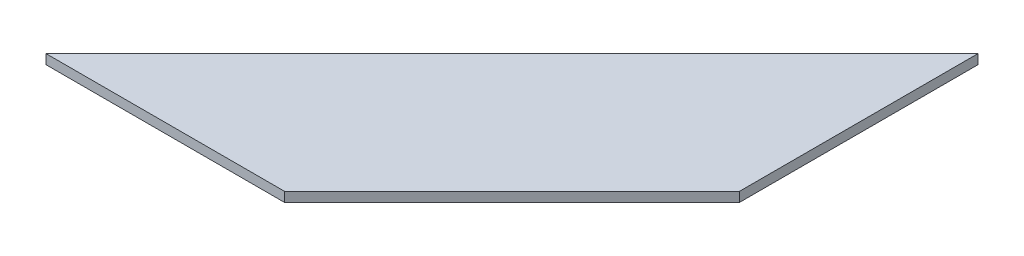
ISO-10303-21;
HEADER;
FILE_DESCRIPTION(('STEP AP214'),'2;1');
FILE_NAME('part.step','',(''),(''),'','','');
FILE_SCHEMA(('AUTOMOTIVE_DESIGN { 1 0 10303 214 1 1 1 1 }'));
ENDSEC;
DATA;
#1=APPLICATION_CONTEXT('core data for automotive mechanical design processes');
#2=APPLICATION_PROTOCOL_DEFINITION('international standard','automotive_design',2000,#1);
#3=PRODUCT_CONTEXT('',#1,'mechanical');
#4=PRODUCT('Part','Part','',(#3));
#5=PRODUCT_RELATED_PRODUCT_CATEGORY('part','',(#4));
#6=PRODUCT_DEFINITION_FORMATION('','',#4);
#7=PRODUCT_DEFINITION_CONTEXT('part definition',#1,'design');
#8=PRODUCT_DEFINITION('design','',#6,#7);
#9=PRODUCT_DEFINITION_SHAPE('','',#8);
#10=(LENGTH_UNIT() NAMED_UNIT(*) SI_UNIT(.MILLI.,.METRE.));
#11=(NAMED_UNIT(*) PLANE_ANGLE_UNIT() SI_UNIT($,.RADIAN.));
#12=(NAMED_UNIT(*) SI_UNIT($,.STERADIAN.) SOLID_ANGLE_UNIT());
#13=UNCERTAINTY_MEASURE_WITH_UNIT(LENGTH_MEASURE(1.E-05),#10,'distance_accuracy_value','');
#14=(GEOMETRIC_REPRESENTATION_CONTEXT(3) GLOBAL_UNCERTAINTY_ASSIGNED_CONTEXT((#13)) GLOBAL_UNIT_ASSIGNED_CONTEXT((#10,
#11,#12)) REPRESENTATION_CONTEXT('',''));
#15=CARTESIAN_POINT('',(0.,0.,0.));
#16=DIRECTION('',(0.,0.,1.));
#17=DIRECTION('',(1.,0.,0.));
#18=AXIS2_PLACEMENT_3D('',#15,#16,#17);
#19=CARTESIAN_POINT('',(-27.1923881554251,10.,41.1421356237309));
#20=DIRECTION('',(-0.707106781186548,0.,-0.707106781186548));
#21=DIRECTION('',(0.707106781186548,0.,-0.707106781186548));
#22=AXIS2_PLACEMENT_3D('',#19,#20,#21);
#23=PLANE('',#22);
#24=DIRECTION('',(0.,1.,0.));
#25=VECTOR('',#24,1.);
#26=CARTESIAN_POINT('',(-27.1923881554251,10.,41.1421356237309));
#27=LINE('',#26,#25);
#28=CARTESIAN_POINT('',(-27.1923881554251,10.,41.1421356237309));
#29=VERTEX_POINT('',#28);
#30=CARTESIAN_POINT('',(-27.1923881554251,10.2,41.1421356237309));
#31=VERTEX_POINT('',#30);
#32=EDGE_CURVE('E11',#29,#31,#27,.T.);
#33=ORIENTED_EDGE('',*,*,#32,.F.);
#34=DIRECTION('',(0.707106781186548,0.,-0.707106781186548));
#35=VECTOR('',#34,1.);
#36=CARTESIAN_POINT('',(-27.1923881554251,10.,41.1421356237309));
#37=LINE('',#36,#35);
#38=CARTESIAN_POINT('',(-22.4704641588708,10.,36.4202116271767));
#39=VERTEX_POINT('',#38);
#40=EDGE_CURVE('E88',#29,#39,#37,.T.);
#41=ORIENTED_EDGE('',*,*,#40,.T.);
#42=DIRECTION('',(0.,1.,0.));
#43=VECTOR('',#42,1.);
#44=CARTESIAN_POINT('',(-22.4704641588708,10.,36.4202116271767));
#45=LINE('',#44,#43);
#46=CARTESIAN_POINT('',(-22.4704641588708,10.2,36.4202116271767));
#47=VERTEX_POINT('',#46);
#48=EDGE_CURVE('E43',#39,#47,#45,.T.);
#49=ORIENTED_EDGE('',*,*,#48,.T.);
#50=DIRECTION('',(0.707106781186548,0.,-0.707106781186548));
#51=VECTOR('',#50,1.);
#52=CARTESIAN_POINT('',(-27.1923881554251,10.2,41.1421356237309));
#53=LINE('',#52,#51);
#54=EDGE_CURVE('E101',#31,#47,#53,.T.);
#55=ORIENTED_EDGE('',*,*,#54,.F.);
#56=EDGE_LOOP('',(#33,#41,#49,#55));
#57=FACE_BOUND('',#56,.T.);
#58=ADVANCED_FACE('F33',(#57),#23,.F.);
#59=CARTESIAN_POINT('',(-22.4704641588708,10.,0.));
#60=DIRECTION('',(-1.,0.,0.));
#61=DIRECTION('',(0.,0.,-1.));
#62=AXIS2_PLACEMENT_3D('',#59,#60,#61);
#63=PLANE('',#62);
#64=ORIENTED_EDGE('',*,*,#48,.F.);
#65=DIRECTION('',(0.,0.,-1.));
#66=VECTOR('',#65,1.);
#67=CARTESIAN_POINT('',(-22.4704641588708,10.,0.));
#68=LINE('',#67,#66);
#69=CARTESIAN_POINT('',(-22.4704641588708,10.,31.4704641588708));
#70=VERTEX_POINT('',#69);
#71=EDGE_CURVE('E95',#39,#70,#68,.T.);
#72=ORIENTED_EDGE('',*,*,#71,.T.);
#73=DIRECTION('',(0.,1.,0.));
#74=VECTOR('',#73,1.);
#75=CARTESIAN_POINT('',(-22.4704641588708,10.,31.4704641588708));
#76=LINE('',#75,#74);
#77=CARTESIAN_POINT('',(-22.4704641588708,10.2,31.4704641588708));
#78=VERTEX_POINT('',#77);
#79=EDGE_CURVE('E51',#70,#78,#76,.T.);
#80=ORIENTED_EDGE('',*,*,#79,.T.);
#81=DIRECTION('',(0.,0.,-1.));
#82=VECTOR('',#81,1.);
#83=CARTESIAN_POINT('',(-22.4704641588708,10.2,0.));
#84=LINE('',#83,#82);
#85=EDGE_CURVE('E82',#47,#78,#84,.T.);
#86=ORIENTED_EDGE('',*,*,#85,.F.);
#87=EDGE_LOOP('',(#64,#72,#80,#86));
#88=FACE_BOUND('',#87,.T.);
#89=ADVANCED_FACE('F105',(#88),#63,.F.);
#90=CARTESIAN_POINT('',(4.5,10.,4.5));
#91=DIRECTION('',(-0.707106781186548,0.,-0.707106781186548));
#92=DIRECTION('',(0.707106781186548,0.,-0.707106781186548));
#93=AXIS2_PLACEMENT_3D('',#90,#91,#92);
#94=PLANE('',#93);
#95=ORIENTED_EDGE('',*,*,#79,.F.);
#96=DIRECTION('',(0.707106781186548,0.,-0.707106781186548));
#97=VECTOR('',#96,1.);
#98=CARTESIAN_POINT('',(4.5,10.,4.5));
#99=LINE('',#98,#97);
#100=CARTESIAN_POINT('',(-32.1421356237309,10.,41.142135623731));
#101=VERTEX_POINT('',#100);
#102=EDGE_CURVE('E87',#101,#70,#99,.T.);
#103=ORIENTED_EDGE('',*,*,#102,.F.);
#104=DIRECTION('',(0.,1.,0.));
#105=VECTOR('',#104,1.);
#106=CARTESIAN_POINT('',(-32.1421356237309,10.,41.142135623731));
#107=LINE('',#106,#105);
#108=CARTESIAN_POINT('',(-32.1421356237309,10.2,41.142135623731));
#109=VERTEX_POINT('',#108);
#110=EDGE_CURVE('E37',#101,#109,#107,.T.);
#111=ORIENTED_EDGE('',*,*,#110,.T.);
#112=DIRECTION('',(0.707106781186548,0.,-0.707106781186548));
#113=VECTOR('',#112,1.);
#114=CARTESIAN_POINT('',(4.5,10.2,4.5));
#115=LINE('',#114,#113);
#116=EDGE_CURVE('E97',#109,#78,#115,.T.);
#117=ORIENTED_EDGE('',*,*,#116,.T.);
#118=EDGE_LOOP('',(#95,#103,#111,#117));
#119=FACE_BOUND('',#118,.T.);
#120=ADVANCED_FACE('F90',(#119),#94,.T.);
#121=CARTESIAN_POINT('',(0.,10.,41.142135623731));
#122=DIRECTION('',(0.,0.,-1.));
#123=DIRECTION('',(1.,0.,0.));
#124=AXIS2_PLACEMENT_3D('',#121,#122,#123);
#125=PLANE('',#124);
#126=DIRECTION('',(1.,0.,0.));
#127=VECTOR('',#126,1.);
#128=CARTESIAN_POINT('',(0.,10.,41.142135623731));
#129=LINE('',#128,#127);
#130=EDGE_CURVE('E76',#101,#29,#129,.T.);
#131=ORIENTED_EDGE('',*,*,#130,.T.);
#132=ORIENTED_EDGE('',*,*,#32,.T.);
#133=DIRECTION('',(1.,0.,0.));
#134=VECTOR('',#133,1.);
#135=CARTESIAN_POINT('',(0.,10.2,41.142135623731));
#136=LINE('',#135,#134);
#137=EDGE_CURVE('E78',#109,#31,#136,.T.);
#138=ORIENTED_EDGE('',*,*,#137,.F.);
#139=ORIENTED_EDGE('',*,*,#110,.F.);
#140=EDGE_LOOP('',(#131,#132,#138,#139));
#141=FACE_BOUND('',#140,.T.);
#142=ADVANCED_FACE('F35',(#141),#125,.F.);
#143=CARTESIAN_POINT('',(0.,10.2,0.));
#144=DIRECTION('',(0.,-1.,0.));
#145=DIRECTION('',(0.,0.,-1.));
#146=AXIS2_PLACEMENT_3D('',#143,#144,#145);
#147=PLANE('',#146);
#148=ORIENTED_EDGE('',*,*,#116,.F.);
#149=ORIENTED_EDGE('',*,*,#137,.T.);
#150=ORIENTED_EDGE('',*,*,#54,.T.);
#151=ORIENTED_EDGE('',*,*,#85,.T.);
#152=EDGE_LOOP('',(#148,#149,#150,#151));
#153=FACE_BOUND('',#152,.T.);
#154=ADVANCED_FACE('F104',(#153),#147,.F.);
#155=CARTESIAN_POINT('',(0.,10.,0.));
#156=DIRECTION('',(0.,-1.,0.));
#157=DIRECTION('',(0.,0.,-1.));
#158=AXIS2_PLACEMENT_3D('',#155,#156,#157);
#159=PLANE('',#158);
#160=ORIENTED_EDGE('',*,*,#102,.T.);
#161=ORIENTED_EDGE('',*,*,#71,.F.);
#162=ORIENTED_EDGE('',*,*,#40,.F.);
#163=ORIENTED_EDGE('',*,*,#130,.F.);
#164=EDGE_LOOP('',(#160,#161,#162,#163));
#165=FACE_BOUND('',#164,.T.);
#166=ADVANCED_FACE('F85',(#165),#159,.T.);
#167=CLOSED_SHELL('',(#58,#89,#120,#142,#154,#166));
#168=MANIFOLD_SOLID_BREP('B2',#167);
#169=ADVANCED_BREP_SHAPE_REPRESENTATION('',(#18,#168),#14);
#170=SHAPE_DEFINITION_REPRESENTATION(#9,#169);
ENDSEC;
END-ISO-10303-21;
